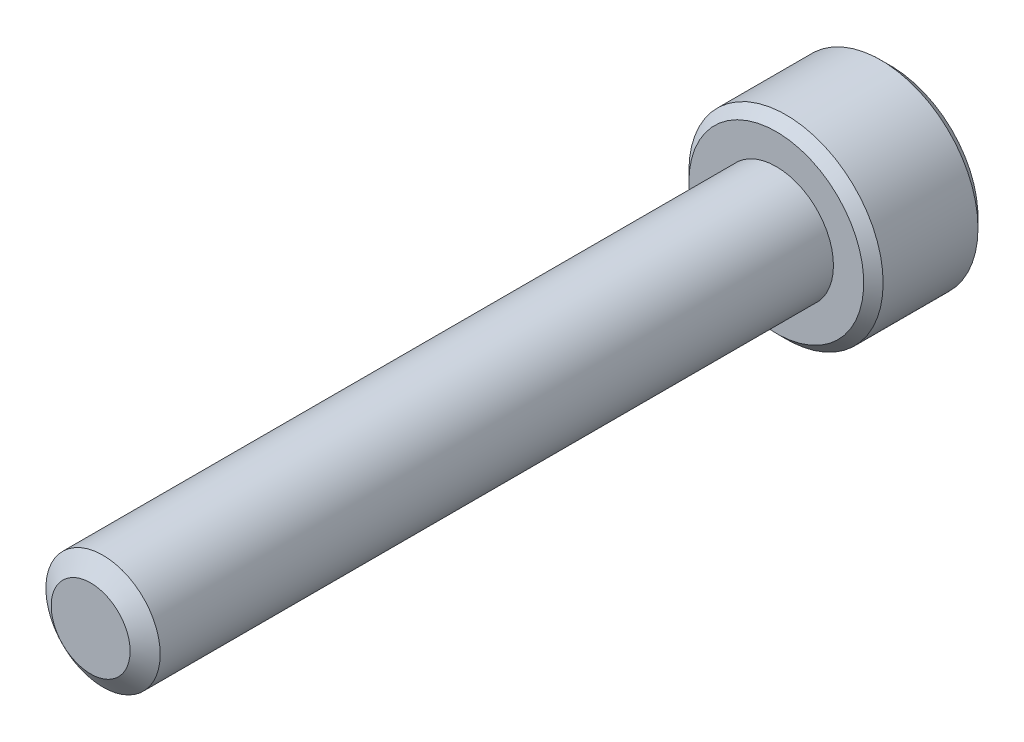
ISO-10303-21;
HEADER;
FILE_DESCRIPTION(('STEP AP214'),'2;1');
FILE_NAME('part.step','',(''),(''),'','','');
FILE_SCHEMA(('AUTOMOTIVE_DESIGN { 1 0 10303 214 1 1 1 1 }'));
ENDSEC;
DATA;
#1=APPLICATION_CONTEXT('core data for automotive mechanical design processes');
#2=APPLICATION_PROTOCOL_DEFINITION('international standard','automotive_design',2000,#1);
#3=PRODUCT_CONTEXT('',#1,'mechanical');
#4=PRODUCT('Part','Part','',(#3));
#5=PRODUCT_RELATED_PRODUCT_CATEGORY('part','',(#4));
#6=PRODUCT_DEFINITION_FORMATION('','',#4);
#7=PRODUCT_DEFINITION_CONTEXT('part definition',#1,'design');
#8=PRODUCT_DEFINITION('design','',#6,#7);
#9=PRODUCT_DEFINITION_SHAPE('','',#8);
#10=(LENGTH_UNIT() NAMED_UNIT(*) SI_UNIT(.MILLI.,.METRE.));
#11=(NAMED_UNIT(*) PLANE_ANGLE_UNIT() SI_UNIT($,.RADIAN.));
#12=(NAMED_UNIT(*) SI_UNIT($,.STERADIAN.) SOLID_ANGLE_UNIT());
#13=UNCERTAINTY_MEASURE_WITH_UNIT(LENGTH_MEASURE(1.E-05),#10,'distance_accuracy_value','');
#14=(GEOMETRIC_REPRESENTATION_CONTEXT(3) GLOBAL_UNCERTAINTY_ASSIGNED_CONTEXT((#13)) GLOBAL_UNIT_ASSIGNED_CONTEXT((#10,
#11,#12)) REPRESENTATION_CONTEXT('',''));
#15=CARTESIAN_POINT('',(0.,0.,0.));
#16=DIRECTION('',(0.,0.,1.));
#17=DIRECTION('',(1.,0.,0.));
#18=AXIS2_PLACEMENT_3D('',#15,#16,#17);
#19=CARTESIAN_POINT('',(0.,0.,-30.));
#20=DIRECTION('',(0.,0.,1.));
#21=DIRECTION('',(1.,0.,0.));
#22=AXIS2_PLACEMENT_3D('',#19,#20,#21);
#23=CYLINDRICAL_SURFACE('',#22,2.5);
#24=CARTESIAN_POINT('',(0.,0.,-30.));
#25=DIRECTION('',(0.,0.,-1.));
#26=DIRECTION('',(-1.,0.,0.));
#27=AXIS2_PLACEMENT_3D('',#24,#25,#26);
#28=CIRCLE('',#27,2.5);
#29=CARTESIAN_POINT('',(-2.5,0.,-30.));
#30=VERTEX_POINT('',#29);
#31=EDGE_CURVE('E213',#30,#30,#28,.F.);
#32=ORIENTED_EDGE('',*,*,#31,.T.);
#33=EDGE_LOOP('',(#32));
#34=FACE_BOUND('',#33,.T.);
#35=CARTESIAN_POINT('',(0.,0.,-0.541691224311848));
#36=DIRECTION('',(0.,0.,1.));
#37=DIRECTION('',(1.,0.,0.));
#38=AXIS2_PLACEMENT_3D('',#35,#36,#37);
#39=CIRCLE('',#38,2.5);
#40=CARTESIAN_POINT('',(2.5,0.,-0.541691224311848));
#41=VERTEX_POINT('',#40);
#42=EDGE_CURVE('E107',#41,#41,#39,.T.);
#43=ORIENTED_EDGE('',*,*,#42,.F.);
#44=EDGE_LOOP('',(#43));
#45=FACE_BOUND('',#44,.T.);
#46=ADVANCED_FACE('F33',(#34,#45),#23,.T.);
#47=CARTESIAN_POINT('',(0.,0.,0.));
#48=DIRECTION('',(0.,0.,-1.));
#49=DIRECTION('',(-1.,0.,0.));
#50=AXIS2_PLACEMENT_3D('',#47,#48,#49);
#51=CONICAL_SURFACE('',#50,1.72638475772933,0.959931088596884);
#52=ORIENTED_EDGE('',*,*,#42,.T.);
#53=EDGE_LOOP('',(#52));
#54=FACE_BOUND('',#53,.T.);
#55=CARTESIAN_POINT('',(0.,0.,0.));
#56=DIRECTION('',(0.,0.,1.));
#57=DIRECTION('',(1.,0.,0.));
#58=AXIS2_PLACEMENT_3D('',#55,#56,#57);
#59=CIRCLE('',#58,1.72638475772933);
#60=CARTESIAN_POINT('',(1.72638475772933,0.,0.));
#61=VERTEX_POINT('',#60);
#62=EDGE_CURVE('E211',#61,#61,#59,.T.);
#63=ORIENTED_EDGE('',*,*,#62,.F.);
#64=EDGE_LOOP('',(#63));
#65=FACE_BOUND('',#64,.T.);
#66=ADVANCED_FACE('F194',(#54,#65),#51,.T.);
#67=CARTESIAN_POINT('',(0.,0.,0.));
#68=DIRECTION('',(0.,0.,1.));
#69=DIRECTION('',(1.,0.,0.));
#70=AXIS2_PLACEMENT_3D('',#67,#68,#69);
#71=PLANE('',#70);
#72=ORIENTED_EDGE('',*,*,#62,.T.);
#73=EDGE_LOOP('',(#72));
#74=FACE_BOUND('',#73,.T.);
#75=ADVANCED_FACE('F191',(#74),#71,.T.);
#76=CARTESIAN_POINT('',(0.,0.,-35.));
#77=DIRECTION('',(0.,0.,1.));
#78=DIRECTION('',(1.,0.,0.));
#79=AXIS2_PLACEMENT_3D('',#76,#77,#78);
#80=CYLINDRICAL_SURFACE('',#79,4.25);
#81=CARTESIAN_POINT('',(0.,0.,-34.575));
#82=DIRECTION('',(0.,0.,-1.));
#83=DIRECTION('',(-1.,0.,0.));
#84=AXIS2_PLACEMENT_3D('',#81,#82,#83);
#85=CIRCLE('',#84,4.25);
#86=CARTESIAN_POINT('',(-4.25,0.,-34.575));
#87=VERTEX_POINT('',#86);
#88=EDGE_CURVE('E41',#87,#87,#85,.F.);
#89=ORIENTED_EDGE('',*,*,#88,.T.);
#90=EDGE_LOOP('',(#89));
#91=FACE_BOUND('',#90,.T.);
#92=CARTESIAN_POINT('',(0.,0.,-30.425));
#93=DIRECTION('',(0.,0.,-1.));
#94=DIRECTION('',(-1.,0.,0.));
#95=AXIS2_PLACEMENT_3D('',#92,#93,#94);
#96=CIRCLE('',#95,4.25);
#97=CARTESIAN_POINT('',(-4.25,0.,-30.425));
#98=VERTEX_POINT('',#97);
#99=EDGE_CURVE('E170',#98,#98,#96,.T.);
#100=ORIENTED_EDGE('',*,*,#99,.T.);
#101=EDGE_LOOP('',(#100));
#102=FACE_BOUND('',#101,.T.);
#103=ADVANCED_FACE('F175',(#91,#102),#80,.T.);
#104=CARTESIAN_POINT('',(0.,0.,-35.));
#105=DIRECTION('',(0.,0.,-1.));
#106=DIRECTION('',(-1.,0.,0.));
#107=AXIS2_PLACEMENT_3D('',#104,#105,#106);
#108=PLANE('',#107);
#109=CARTESIAN_POINT('',(0.,0.,-35.));
#110=DIRECTION('',(0.,0.,-1.));
#111=DIRECTION('',(-1.,0.,0.));
#112=AXIS2_PLACEMENT_3D('',#109,#110,#111);
#113=CIRCLE('',#112,3.82500000000001);
#114=CARTESIAN_POINT('',(-3.82500000000001,0.,-35.));
#115=VERTEX_POINT('',#114);
#116=EDGE_CURVE('E106',#115,#115,#113,.T.);
#117=ORIENTED_EDGE('',*,*,#116,.T.);
#118=EDGE_LOOP('',(#117));
#119=FACE_BOUND('',#118,.T.);
#120=CARTESIAN_POINT('',(0.,0.,-35.));
#121=DIRECTION('',(0.,0.,-1.));
#122=DIRECTION('',(-1.,0.,0.));
#123=AXIS2_PLACEMENT_3D('',#120,#121,#122);
#124=CIRCLE('',#123,2.3094010767585);
#125=CARTESIAN_POINT('',(-2.,1.15470053837925,-35.));
#126=VERTEX_POINT('',#125);
#127=CARTESIAN_POINT('',(0.,2.3094010767585,-35.));
#128=VERTEX_POINT('',#127);
#129=EDGE_CURVE('E87',#126,#128,#124,.T.);
#130=ORIENTED_EDGE('',*,*,#129,.F.);
#131=CARTESIAN_POINT('',(-2.,-1.15470053837925,-35.));
#132=VERTEX_POINT('',#131);
#133=EDGE_CURVE('E47',#132,#126,#124,.T.);
#134=ORIENTED_EDGE('',*,*,#133,.F.);
#135=CARTESIAN_POINT('',(0.,-2.3094010767585,-35.));
#136=VERTEX_POINT('',#135);
#137=EDGE_CURVE('E272',#136,#132,#124,.T.);
#138=ORIENTED_EDGE('',*,*,#137,.F.);
#139=CARTESIAN_POINT('',(2.,-1.15470053837925,-35.));
#140=VERTEX_POINT('',#139);
#141=EDGE_CURVE('E54',#140,#136,#124,.T.);
#142=ORIENTED_EDGE('',*,*,#141,.F.);
#143=CARTESIAN_POINT('',(2.,1.15470053837925,-35.));
#144=VERTEX_POINT('',#143);
#145=EDGE_CURVE('E128',#144,#140,#124,.T.);
#146=ORIENTED_EDGE('',*,*,#145,.F.);
#147=EDGE_CURVE('E96',#128,#144,#124,.T.);
#148=ORIENTED_EDGE('',*,*,#147,.F.);
#149=EDGE_LOOP('',(#130,#134,#138,#142,#146,#148));
#150=FACE_BOUND('',#149,.T.);
#151=ADVANCED_FACE('F127',(#119,#150),#108,.T.);
#152=CARTESIAN_POINT('',(0.,0.,-30.));
#153=DIRECTION('',(0.,0.,-1.));
#154=DIRECTION('',(-1.,0.,0.));
#155=AXIS2_PLACEMENT_3D('',#152,#153,#154);
#156=PLANE('',#155);
#157=CARTESIAN_POINT('',(0.,0.,-30.));
#158=DIRECTION('',(0.,0.,-1.));
#159=DIRECTION('',(-1.,0.,0.));
#160=AXIS2_PLACEMENT_3D('',#157,#158,#159);
#161=CIRCLE('',#160,3.82499999999999);
#162=CARTESIAN_POINT('',(-3.82499999999999,0.,-30.));
#163=VERTEX_POINT('',#162);
#164=EDGE_CURVE('E11',#163,#163,#161,.F.);
#165=ORIENTED_EDGE('',*,*,#164,.T.);
#166=EDGE_LOOP('',(#165));
#167=FACE_BOUND('',#166,.T.);
#168=ORIENTED_EDGE('',*,*,#31,.F.);
#169=EDGE_LOOP('',(#168));
#170=FACE_BOUND('',#169,.T.);
#171=ADVANCED_FACE('F184',(#167,#170),#156,.F.);
#172=CARTESIAN_POINT('',(0.,0.,-35.));
#173=DIRECTION('',(0.,0.,-1.));
#174=DIRECTION('',(-1.,0.,0.));
#175=AXIS2_PLACEMENT_3D('',#172,#173,#174);
#176=CONICAL_SURFACE('',#175,2.3094010767585,0.78539816339745);
#177=ORIENTED_EDGE('',*,*,#147,.T.);
#178=CARTESIAN_POINT('',(-0.000200000000000658,2.30951654681234,-35.0001154787137));
#179=CARTESIAN_POINT('',(0.0685530340307045,2.26982196410711,-34.9604530902256));
#180=CARTESIAN_POINT('',(0.138455742135511,2.22946361676572,-34.9231199822842));
#181=CARTESIAN_POINT('',(0.280995244550436,2.1471683966763,-34.8547636851361));
#182=CARTESIAN_POINT('',(0.353645597565358,2.10522369580642,-34.8237785337372));
#183=CARTESIAN_POINT('',(0.500141601053971,2.02064418875706,-34.7707002165441));
#184=CARTESIAN_POINT('',(0.573949935246294,1.97803092714269,-34.7484736271766));
#185=CARTESIAN_POINT('',(0.723191631835264,1.89186619344273,-34.7142288166751));
#186=CARTESIAN_POINT('',(0.798620433918152,1.84831735425552,-34.7021850291441));
#187=CARTESIAN_POINT('',(0.928615500671079,1.7732646674724,-34.6913185119056));
#188=CARTESIAN_POINT('',(0.983013783970109,1.74185780396625,-34.68970975361));
#189=CARTESIAN_POINT('',(1.09172145551969,1.67909540053412,-34.6924188775987));
#190=CARTESIAN_POINT('',(1.14603080592134,1.64773988246021,-34.696738837758));
#191=CARTESIAN_POINT('',(1.25413672758934,1.5853248994842,-34.7110595674099));
#192=CARTESIAN_POINT('',(1.30793265655479,1.55426580541469,-34.721066692762));
#193=CARTESIAN_POINT('',(1.41459426230557,1.49268469862228,-34.7462124302497));
#194=CARTESIAN_POINT('',(1.46746001007071,1.46216264491917,-34.7613506490422));
#195=CARTESIAN_POINT('',(1.60287973308984,1.38397803138049,-34.8062945034292));
#196=CARTESIAN_POINT('',(1.68459383484948,1.33680037273297,-34.8394888394258));
#197=CARTESIAN_POINT('',(1.8047470372578,1.26742988897853,-34.8955258231714));
#198=CARTESIAN_POINT('',(1.84434285210918,1.24456923461531,-34.9152147029469));
#199=CARTESIAN_POINT('',(1.92280095888787,1.19927142554652,-34.9563873183649));
#200=CARTESIAN_POINT('',(1.96166368359374,1.17683402097614,-34.9778699516512));
#201=CARTESIAN_POINT('',(2.0002,1.15458506832541,-35.0001154787137));
#202=B_SPLINE_CURVE_WITH_KNOTS('',3,(#178,#179,#180,#181,#182,#183,#184,#185,#186,#187,#188,
#189,#190,#191,#192,#193,#194,#195,#196,#197,#198,#199,#200,#201),.UNSPECIFIED.,.F.,.F.,(4,2,2,
2,2,2,2,2,2,2,2,4),(0.,0.266420613771064,0.534393751523387,0.798110374376916,1.06116288956936,
1.24939906803722,1.43770123566248,1.62621426093932,1.81471283831913,2.11415604834145,
2.2634717071779,2.41269626969771),.UNSPECIFIED.);
#203=EDGE_CURVE('E101',#128,#144,#202,.T.);
#204=ORIENTED_EDGE('',*,*,#203,.F.);
#205=EDGE_LOOP('',(#177,#204));
#206=FACE_BOUND('',#205,.T.);
#207=ADVANCED_FACE('F102',(#206),#176,.F.);
#208=ORIENTED_EDGE('',*,*,#145,.T.);
#209=CARTESIAN_POINT('',(2.,-2.30294417292923,-35.7407713550277));
#210=CARTESIAN_POINT('',(2.,-2.24687002663712,-35.698443273626));
#211=CARTESIAN_POINT('',(2.,-2.19048190536959,-35.6565251568643));
#212=CARTESIAN_POINT('',(2.,-2.07695390496424,-35.573690417861));
#213=CARTESIAN_POINT('',(2.,-2.01981384066454,-35.5327740496681));
#214=CARTESIAN_POINT('',(2.,-1.90424016804776,-35.4518334520186));
#215=CARTESIAN_POINT('',(2.,-1.8457999674391,-35.4118185915599));
#216=CARTESIAN_POINT('',(2.,-1.7279274546176,-35.3332889936643));
#217=CARTESIAN_POINT('',(2.,-1.66849521292324,-35.2947741502431));
#218=CARTESIAN_POINT('',(2.,-1.4816299571002,-35.1776406516043));
#219=CARTESIAN_POINT('',(2.,-1.35220318163536,-35.1021459017296));
#220=CARTESIAN_POINT('',(2.,-1.08689521592925,-34.9640493509944));
#221=CARTESIAN_POINT('',(2.,-0.951037763938192,-34.9014040859035));
#222=CARTESIAN_POINT('',(2.,-0.747111912259409,-34.8247635438751));
#223=CARTESIAN_POINT('',(2.,-0.682064034147876,-34.8027671799191));
#224=CARTESIAN_POINT('',(2.,-0.550398103294752,-34.7639966876601));
#225=CARTESIAN_POINT('',(2.,-0.483779942722475,-34.7472229191212));
#226=CARTESIAN_POINT('',(2.,-0.350484328847653,-34.7200482578844));
#227=CARTESIAN_POINT('',(2.,-0.283829489364784,-34.7095381767417));
#228=CARTESIAN_POINT('',(2.,-0.149806987139375,-34.6950960855449));
#229=CARTESIAN_POINT('',(2.,-0.0824394489341207,-34.6911629447331));
#230=CARTESIAN_POINT('',(2.,0.049905562294491,-34.6901664769337));
#231=CARTESIAN_POINT('',(2.,0.114881285143174,-34.6928596448504));
#232=CARTESIAN_POINT('',(2.,0.244275921482762,-34.7044300704227));
#233=CARTESIAN_POINT('',(2.,0.308694780266755,-34.7133079288332));
#234=CARTESIAN_POINT('',(2.,0.437599788610706,-34.7369136592961));
#235=CARTESIAN_POINT('',(2.,0.502067428644597,-34.7517410834465));
#236=CARTESIAN_POINT('',(2.,0.629594322598308,-34.786457883628));
#237=CARTESIAN_POINT('',(2.,0.692653693883152,-34.8063468361063));
#238=CARTESIAN_POINT('',(2.,0.891187889210544,-34.8764469792562));
#239=CARTESIAN_POINT('',(2.,1.02383545707306,-34.9346418003215));
#240=CARTESIAN_POINT('',(2.,1.28290932150074,-35.0640305754596));
#241=CARTESIAN_POINT('',(2.,1.4093111258757,-35.1352712314148));
#242=CARTESIAN_POINT('',(2.,1.59200441438963,-35.2464419918747));
#243=CARTESIAN_POINT('',(2.,1.65027549026191,-35.2831821903374));
#244=CARTESIAN_POINT('',(2.,1.76581760389243,-35.3582145141838));
#245=CARTESIAN_POINT('',(2.,1.82308856543105,-35.396506757118));
#246=CARTESIAN_POINT('',(2.,1.93629654762084,-35.4740422640812));
#247=CARTESIAN_POINT('',(2.,1.99224062500539,-35.5132752761336));
#248=CARTESIAN_POINT('',(2.,2.103364240299,-35.5927788307365));
#249=CARTESIAN_POINT('',(2.,2.15854398422468,-35.6330490850006));
#250=CARTESIAN_POINT('',(2.,2.21340370692659,-35.6737442381459));
#251=B_SPLINE_CURVE_WITH_KNOTS('',3,(#209,#210,#211,#212,#213,#214,#215,#216,#217,#218,#219,
#220,#221,#222,#223,#224,#225,#226,#227,#228,#229,#230,#231,#232,#233,#234,#235,#236,#237,#238,
#239,#240,#241,#242,#243,#244,#245,#246,#247,#248,#249,#250),.UNSPECIFIED.,.F.,.F.,(4,2,2,2,2,2,
2,2,2,2,2,2,2,2,2,2,2,2,2,2,4),(0.,0.210772731976897,0.421598374658589,0.634057554623493,
0.846501695870168,1.29562155455624,1.74319622821645,1.94902062110207,2.15485918928326,
2.35699582502635,2.5590977043214,2.75388435553556,2.94868993014815,3.14690093452586,
3.34509535789702,3.77838155837653,4.21325029921625,4.41989056685647,4.62654651460921,
4.8315237711129,5.03644465914085),.UNSPECIFIED.);
#252=EDGE_CURVE('E95',#144,#140,#251,.F.);
#253=ORIENTED_EDGE('',*,*,#252,.F.);
#254=EDGE_LOOP('',(#208,#253));
#255=FACE_BOUND('',#254,.T.);
#256=ADVANCED_FACE('F278',(#255),#176,.F.);
#257=ORIENTED_EDGE('',*,*,#141,.T.);
#258=CARTESIAN_POINT('',(2.0002,-1.15458506832541,-35.0001154787137));
#259=CARTESIAN_POINT('',(1.9314469659693,-1.19427965103064,-34.9604530902256));
#260=CARTESIAN_POINT('',(1.86154425786449,-1.23463799837204,-34.9231199822842));
#261=CARTESIAN_POINT('',(1.71900475544956,-1.31693321846145,-34.8547636851361));
#262=CARTESIAN_POINT('',(1.64635440243464,-1.35887791933134,-34.8237785337372));
#263=CARTESIAN_POINT('',(1.49985839894603,-1.44345742638069,-34.7707002165441));
#264=CARTESIAN_POINT('',(1.42605006475371,-1.48607068799507,-34.7484736271766));
#265=CARTESIAN_POINT('',(1.27680836816473,-1.57223542169503,-34.7142288166751));
#266=CARTESIAN_POINT('',(1.20137956608185,-1.61578426088223,-34.7021850291441));
#267=CARTESIAN_POINT('',(1.07138449932892,-1.69083694766536,-34.6913185119056));
#268=CARTESIAN_POINT('',(1.01698621602989,-1.72224381117151,-34.68970975361));
#269=CARTESIAN_POINT('',(0.908278544480305,-1.78500621460364,-34.6924188775987));
#270=CARTESIAN_POINT('',(0.853969194078659,-1.81636173267754,-34.696738837758));
#271=CARTESIAN_POINT('',(0.745863272410661,-1.87877671565355,-34.7110595674099));
#272=CARTESIAN_POINT('',(0.692067343445207,-1.90983580972306,-34.721066692762));
#273=CARTESIAN_POINT('',(0.585405737694426,-1.97141691651548,-34.7462124302497));
#274=CARTESIAN_POINT('',(0.532539989929286,-2.00193897021859,-34.7613506490422));
#275=CARTESIAN_POINT('',(0.397120266910154,-2.08012358375727,-34.8062945034292));
#276=CARTESIAN_POINT('',(0.31540616515052,-2.12730124240478,-34.8394888394258));
#277=CARTESIAN_POINT('',(0.195252962742195,-2.19667172615922,-34.8955258231714));
#278=CARTESIAN_POINT('',(0.155657147890821,-2.21953238052245,-34.9152147029469));
#279=CARTESIAN_POINT('',(0.077199041112126,-2.26483018959124,-34.9563873183649));
#280=CARTESIAN_POINT('',(0.0383363164062586,-2.28726759416161,-34.9778699516512));
#281=CARTESIAN_POINT('',(-0.000200000000000028,-2.30951654681234,-35.0001154787137));
#282=B_SPLINE_CURVE_WITH_KNOTS('',3,(#258,#259,#260,#261,#262,#263,#264,#265,#266,#267,#268,
#269,#270,#271,#272,#273,#274,#275,#276,#277,#278,#279,#280,#281),.UNSPECIFIED.,.F.,.F.,(4,2,2,
2,2,2,2,2,2,2,2,4),(0.,0.266420613771062,0.534393751523388,0.798110374376917,1.06116288956937,
1.24939906803722,1.43770123566248,1.62621426093932,1.81471283831914,2.11415604834145,
2.26347170717791,2.41269626969771),.UNSPECIFIED.);
#283=EDGE_CURVE('E138',#140,#136,#282,.T.);
#284=ORIENTED_EDGE('',*,*,#283,.F.);
#285=EDGE_LOOP('',(#257,#284));
#286=FACE_BOUND('',#285,.T.);
#287=ADVANCED_FACE('F275',(#286),#176,.F.);
#288=ORIENTED_EDGE('',*,*,#137,.T.);
#289=CARTESIAN_POINT('',(0.00020000000000056,-2.30951654681234,-35.0001154787137));
#290=CARTESIAN_POINT('',(-0.0685530340307041,-2.26982196410711,-34.9604530902256));
#291=CARTESIAN_POINT('',(-0.13845574213551,-2.22946361676572,-34.9231199822842));
#292=CARTESIAN_POINT('',(-0.280995244550436,-2.1471683966763,-34.8547636851361));
#293=CARTESIAN_POINT('',(-0.353645597565358,-2.10522369580642,-34.8237785337372));
#294=CARTESIAN_POINT('',(-0.500141601053972,-2.02064418875706,-34.7707002165441));
#295=CARTESIAN_POINT('',(-0.573949935246295,-1.97803092714269,-34.7484736271766));
#296=CARTESIAN_POINT('',(-0.723191631835264,-1.89186619344273,-34.7142288166751));
#297=CARTESIAN_POINT('',(-0.798620433918152,-1.84831735425552,-34.7021850291441));
#298=CARTESIAN_POINT('',(-0.92861550067108,-1.7732646674724,-34.6913185119056));
#299=CARTESIAN_POINT('',(-0.98301378397011,-1.74185780396625,-34.68970975361));
#300=CARTESIAN_POINT('',(-1.09172145551969,-1.67909540053412,-34.6924188775987));
#301=CARTESIAN_POINT('',(-1.14603080592134,-1.64773988246021,-34.696738837758));
#302=CARTESIAN_POINT('',(-1.25413672758934,-1.5853248994842,-34.7110595674099));
#303=CARTESIAN_POINT('',(-1.30793265655479,-1.55426580541469,-34.721066692762));
#304=CARTESIAN_POINT('',(-1.41459426230557,-1.49268469862228,-34.7462124302497));
#305=CARTESIAN_POINT('',(-1.46746001007071,-1.46216264491917,-34.7613506490422));
#306=CARTESIAN_POINT('',(-1.60287973308984,-1.38397803138049,-34.8062945034292));
#307=CARTESIAN_POINT('',(-1.68459383484948,-1.33680037273297,-34.8394888394258));
#308=CARTESIAN_POINT('',(-1.8047470372578,-1.26742988897853,-34.8955258231714));
#309=CARTESIAN_POINT('',(-1.84434285210918,-1.24456923461531,-34.9152147029469));
#310=CARTESIAN_POINT('',(-1.92280095888787,-1.19927142554652,-34.9563873183649));
#311=CARTESIAN_POINT('',(-1.96166368359374,-1.17683402097614,-34.9778699516512));
#312=CARTESIAN_POINT('',(-2.0002,-1.15458506832541,-35.0001154787137));
#313=B_SPLINE_CURVE_WITH_KNOTS('',3,(#289,#290,#291,#292,#293,#294,#295,#296,#297,#298,#299,
#300,#301,#302,#303,#304,#305,#306,#307,#308,#309,#310,#311,#312),.UNSPECIFIED.,.F.,.F.,(4,2,2,
2,2,2,2,2,2,2,2,4),(0.,0.266420613771063,0.534393751523388,0.798110374376916,1.06116288956937,
1.24939906803722,1.43770123566248,1.62621426093932,1.81471283831913,2.11415604834145,
2.26347170717791,2.41269626969771),.UNSPECIFIED.);
#314=EDGE_CURVE('E249',#136,#132,#313,.T.);
#315=ORIENTED_EDGE('',*,*,#314,.F.);
#316=EDGE_LOOP('',(#288,#315));
#317=FACE_BOUND('',#316,.T.);
#318=ADVANCED_FACE('F274',(#317),#176,.F.);
#319=ORIENTED_EDGE('',*,*,#133,.T.);
#320=CARTESIAN_POINT('',(-2.,-2.30294417326429,-35.7407713552807));
#321=CARTESIAN_POINT('',(-2.,-2.24687002696278,-35.6984432738692));
#322=CARTESIAN_POINT('',(-2.,-2.19048190568582,-35.6565251570978));
#323=CARTESIAN_POINT('',(-2.,-2.07695390526152,-35.5736904180751));
#324=CARTESIAN_POINT('',(-2.,-2.01981384095229,-35.5327740498725));
#325=CARTESIAN_POINT('',(-2.,-1.90424016831613,-35.4518334522036));
#326=CARTESIAN_POINT('',(-2.,-1.84579996769763,-35.4118185917351));
#327=CARTESIAN_POINT('',(-2.,-1.72792745485625,-35.3332889938203));
#328=CARTESIAN_POINT('',(-2.,-1.66849521315186,-35.2947741503895));
#329=CARTESIAN_POINT('',(-2.,-1.48162995729573,-35.1776406517203));
#330=CARTESIAN_POINT('',(-2.,-1.35220318180736,-35.1021459018253));
#331=CARTESIAN_POINT('',(-2.,-1.08689521605219,-34.9640493510523));
#332=CARTESIAN_POINT('',(-2.,-0.951037764035625,-34.901404085944));
#333=CARTESIAN_POINT('',(-2.,-0.747111912337645,-34.8247635439028));
#334=CARTESIAN_POINT('',(-2.,-0.68206403423415,-34.8027671799472));
#335=CARTESIAN_POINT('',(-2.,-0.550398103397367,-34.7639966876876));
#336=CARTESIAN_POINT('',(-2.,-0.483779942833393,-34.7472229191476));
#337=CARTESIAN_POINT('',(-2.,-0.350484328974901,-34.7200482579067));
#338=CARTESIAN_POINT('',(-2.,-0.283829489500056,-34.709538176761));
#339=CARTESIAN_POINT('',(-2.,-0.149806987290425,-34.6950960855565));
#340=CARTESIAN_POINT('',(-2.,-0.0824394490929259,-34.6911629447399));
#341=CARTESIAN_POINT('',(-2.,0.0499055621213773,-34.6901664769296));
#342=CARTESIAN_POINT('',(-2.,0.114881284963487,-34.6928596448403));
#343=CARTESIAN_POINT('',(-2.,0.244275921290586,-34.7044300703996));
#344=CARTESIAN_POINT('',(-2.,0.308694780068663,-34.7133079288031));
#345=CARTESIAN_POINT('',(-2.,0.437599788400935,-34.7369136592514));
#346=CARTESIAN_POINT('',(-2.,0.502067428429081,-34.7517410833941));
#347=CARTESIAN_POINT('',(-2.,0.629594322371855,-34.78645788356));
#348=CARTESIAN_POINT('',(-2.,0.692653693651508,-34.8063468360305));
#349=CARTESIAN_POINT('',(-2.,0.89118788892846,-34.8764469791434));
#350=CARTESIAN_POINT('',(-2.,1.02383545674826,-34.9346418001747));
#351=CARTESIAN_POINT('',(-2.,1.28290932109377,-35.0640305752409));
#352=CARTESIAN_POINT('',(-2.,1.40931112542931,-35.1352712311583));
#353=CARTESIAN_POINT('',(-2.,1.59200441388853,-35.2464419915627));
#354=CARTESIAN_POINT('',(-2.,1.6502754897448,-35.2831821900083));
#355=CARTESIAN_POINT('',(-2.,1.76581760334353,-35.3582145138205));
#356=CARTESIAN_POINT('',(-2.,1.82308856486637,-35.3965067567377));
#357=CARTESIAN_POINT('',(-2.,1.93629654702499,-35.4740422636668));
#358=CARTESIAN_POINT('',(-2.,1.99224062439413,-35.5132752757022));
#359=CARTESIAN_POINT('',(-2.,2.10336423965704,-35.5927788302713));
#360=CARTESIAN_POINT('',(-2.,2.15854398356742,-35.6330490845185));
#361=CARTESIAN_POINT('',(-2.,2.21340370625405,-35.6737442376469));
#362=B_SPLINE_CURVE_WITH_KNOTS('',3,(#320,#321,#322,#323,#324,#325,#326,#327,#328,#329,#330,
#331,#332,#333,#334,#335,#336,#337,#338,#339,#340,#341,#342,#343,#344,#345,#346,#347,#348,#349,
#350,#351,#352,#353,#354,#355,#356,#357,#358,#359,#360,#361),.UNSPECIFIED.,.F.,.F.,(4,2,2,2,2,2,
2,2,2,2,2,2,2,2,2,2,2,2,2,2,4),(0.,0.210772732017007,0.421598374738837,0.634057554744618,
0.846501696032178,1.29562155480993,1.74319622856096,1.94902062142334,2.15485918958132,
2.35699582530215,2.55909770457494,2.75388435576874,2.94868993036093,3.14690093471669,
3.34509535806591,3.7783815583877,4.21325029906865,4.41989056664096,4.62654651432578,
4.83152377076247,5.03644465872343),.UNSPECIFIED.);
#363=EDGE_CURVE('E117',#132,#126,#362,.T.);
#364=ORIENTED_EDGE('',*,*,#363,.F.);
#365=EDGE_LOOP('',(#319,#364));
#366=FACE_BOUND('',#365,.T.);
#367=ADVANCED_FACE('F287',(#366),#176,.F.);
#368=ORIENTED_EDGE('',*,*,#129,.T.);
#369=CARTESIAN_POINT('',(-2.0002,1.15458506832541,-35.0001154787137));
#370=CARTESIAN_POINT('',(-1.93144696596929,1.19427965103064,-34.9604530902256));
#371=CARTESIAN_POINT('',(-1.86154425786449,1.23463799837204,-34.9231199822842));
#372=CARTESIAN_POINT('',(-1.71900475544956,1.31693321846145,-34.8547636851361));
#373=CARTESIAN_POINT('',(-1.64635440243464,1.35887791933134,-34.8237785337372));
#374=CARTESIAN_POINT('',(-1.49985839894603,1.44345742638069,-34.7707002165441));
#375=CARTESIAN_POINT('',(-1.42605006475371,1.48607068799507,-34.7484736271766));
#376=CARTESIAN_POINT('',(-1.27680836816474,1.57223542169503,-34.7142288166751));
#377=CARTESIAN_POINT('',(-1.20137956608185,1.61578426088223,-34.7021850291441));
#378=CARTESIAN_POINT('',(-1.07138449932892,1.69083694766536,-34.6913185119056));
#379=CARTESIAN_POINT('',(-1.01698621602989,1.72224381117151,-34.68970975361));
#380=CARTESIAN_POINT('',(-0.908278544480305,1.78500621460364,-34.6924188775987));
#381=CARTESIAN_POINT('',(-0.85396919407866,1.81636173267754,-34.696738837758));
#382=CARTESIAN_POINT('',(-0.745863272410661,1.87877671565355,-34.7110595674099));
#383=CARTESIAN_POINT('',(-0.692067343445207,1.90983580972306,-34.721066692762));
#384=CARTESIAN_POINT('',(-0.585405737694425,1.97141691651547,-34.7462124302497));
#385=CARTESIAN_POINT('',(-0.532539989929286,2.00193897021859,-34.7613506490422));
#386=CARTESIAN_POINT('',(-0.397120266910154,2.08012358375727,-34.8062945034292));
#387=CARTESIAN_POINT('',(-0.315406165150519,2.12730124240478,-34.8394888394258));
#388=CARTESIAN_POINT('',(-0.195252962742196,2.19667172615922,-34.8955258231714));
#389=CARTESIAN_POINT('',(-0.155657147890822,2.21953238052245,-34.9152147029469));
#390=CARTESIAN_POINT('',(-0.0771990411121279,2.26483018959123,-34.9563873183649));
#391=CARTESIAN_POINT('',(-0.0383363164062598,2.28726759416161,-34.9778699516512));
#392=CARTESIAN_POINT('',(0.000200000000000961,2.30951654681234,-35.0001154787137));
#393=B_SPLINE_CURVE_WITH_KNOTS('',3,(#369,#370,#371,#372,#373,#374,#375,#376,#377,#378,#379,
#380,#381,#382,#383,#384,#385,#386,#387,#388,#389,#390,#391,#392),.UNSPECIFIED.,.F.,.F.,(4,2,2,
2,2,2,2,2,2,2,2,4),(0.,0.266420613771064,0.534393751523388,0.798110374376916,1.06116288956937,
1.24939906803722,1.43770123566248,1.62621426093932,1.81471283831913,2.11415604834145,
2.26347170717791,2.41269626969771),.UNSPECIFIED.);
#394=EDGE_CURVE('E91',#126,#128,#393,.T.);
#395=ORIENTED_EDGE('',*,*,#394,.F.);
#396=EDGE_LOOP('',(#368,#395));
#397=FACE_BOUND('',#396,.T.);
#398=ADVANCED_FACE('F89',(#397),#176,.F.);
#399=CARTESIAN_POINT('',(2.,3.46410161513775,-32.));
#400=DIRECTION('',(0.,0.,-1.));
#401=DIRECTION('',(-1.,0.,0.));
#402=AXIS2_PLACEMENT_3D('',#399,#400,#401);
#403=PLANE('',#402);
#404=DIRECTION('',(0.866025403784439,0.5,0.));
#405=VECTOR('',#404,1.);
#406=CARTESIAN_POINT('',(-2.,1.15470053837925,-32.));
#407=LINE('',#406,#405);
#408=CARTESIAN_POINT('',(-2.,1.15470053837925,-32.));
#409=VERTEX_POINT('',#408);
#410=CARTESIAN_POINT('',(0.,2.3094010767585,-32.));
#411=VERTEX_POINT('',#410);
#412=EDGE_CURVE('E116',#409,#411,#407,.T.);
#413=ORIENTED_EDGE('',*,*,#412,.T.);
#414=DIRECTION('',(0.866025403784439,-0.5,0.));
#415=VECTOR('',#414,1.);
#416=CARTESIAN_POINT('',(0.,2.3094010767585,-32.));
#417=LINE('',#416,#415);
#418=CARTESIAN_POINT('',(2.,1.15470053837925,-32.));
#419=VERTEX_POINT('',#418);
#420=EDGE_CURVE('E121',#411,#419,#417,.T.);
#421=ORIENTED_EDGE('',*,*,#420,.T.);
#422=DIRECTION('',(0.,-1.,0.));
#423=VECTOR('',#422,1.);
#424=CARTESIAN_POINT('',(2.,1.15470053837925,-32.));
#425=LINE('',#424,#423);
#426=CARTESIAN_POINT('',(2.,-1.15470053837925,-32.));
#427=VERTEX_POINT('',#426);
#428=EDGE_CURVE('E235',#419,#427,#425,.T.);
#429=ORIENTED_EDGE('',*,*,#428,.T.);
#430=DIRECTION('',(-0.866025403784439,-0.5,0.));
#431=VECTOR('',#430,1.);
#432=CARTESIAN_POINT('',(2.,-1.15470053837925,-32.));
#433=LINE('',#432,#431);
#434=CARTESIAN_POINT('',(0.,-2.3094010767585,-32.));
#435=VERTEX_POINT('',#434);
#436=EDGE_CURVE('E232',#427,#435,#433,.T.);
#437=ORIENTED_EDGE('',*,*,#436,.T.);
#438=DIRECTION('',(-0.866025403784439,0.5,0.));
#439=VECTOR('',#438,1.);
#440=CARTESIAN_POINT('',(0.,-2.3094010767585,-32.));
#441=LINE('',#440,#439);
#442=CARTESIAN_POINT('',(-2.,-1.15470053837925,-32.));
#443=VERTEX_POINT('',#442);
#444=EDGE_CURVE('E229',#435,#443,#441,.T.);
#445=ORIENTED_EDGE('',*,*,#444,.T.);
#446=DIRECTION('',(0.,1.,0.));
#447=VECTOR('',#446,1.);
#448=CARTESIAN_POINT('',(-2.,-1.15470053837925,-32.));
#449=LINE('',#448,#447);
#450=EDGE_CURVE('E124',#443,#409,#449,.T.);
#451=ORIENTED_EDGE('',*,*,#450,.T.);
#452=EDGE_LOOP('',(#413,#421,#429,#437,#445,#451));
#453=FACE_BOUND('',#452,.T.);
#454=ADVANCED_FACE('F158',(#453),#403,.T.);
#455=CARTESIAN_POINT('',(0.,2.3094010767585,-32.));
#456=DIRECTION('',(0.5,0.866025403784439,0.));
#457=DIRECTION('',(-0.866025403784439,0.5,0.));
#458=AXIS2_PLACEMENT_3D('',#455,#456,#457);
#459=PLANE('',#458);
#460=DIRECTION('',(0.,0.,-1.));
#461=VECTOR('',#460,1.);
#462=CARTESIAN_POINT('',(0.,2.3094010767585,-32.));
#463=LINE('',#462,#461);
#464=EDGE_CURVE('E113',#411,#128,#463,.T.);
#465=ORIENTED_EDGE('',*,*,#464,.T.);
#466=ORIENTED_EDGE('',*,*,#203,.T.);
#467=DIRECTION('',(0.,0.,-1.));
#468=VECTOR('',#467,1.);
#469=CARTESIAN_POINT('',(2.,1.15470053837925,-32.));
#470=LINE('',#469,#468);
#471=EDGE_CURVE('E123',#419,#144,#470,.T.);
#472=ORIENTED_EDGE('',*,*,#471,.F.);
#473=ORIENTED_EDGE('',*,*,#420,.F.);
#474=EDGE_LOOP('',(#465,#466,#472,#473));
#475=FACE_BOUND('',#474,.T.);
#476=ADVANCED_FACE('F119',(#475),#459,.F.);
#477=CARTESIAN_POINT('',(2.,1.15470053837925,-32.));
#478=DIRECTION('',(1.,0.,0.));
#479=DIRECTION('',(0.,0.,-1.));
#480=AXIS2_PLACEMENT_3D('',#477,#478,#479);
#481=PLANE('',#480);
#482=ORIENTED_EDGE('',*,*,#471,.T.);
#483=ORIENTED_EDGE('',*,*,#252,.T.);
#484=DIRECTION('',(0.,0.,-1.));
#485=VECTOR('',#484,1.);
#486=CARTESIAN_POINT('',(2.,-1.15470053837925,-32.));
#487=LINE('',#486,#485);
#488=EDGE_CURVE('E218',#427,#140,#487,.T.);
#489=ORIENTED_EDGE('',*,*,#488,.F.);
#490=ORIENTED_EDGE('',*,*,#428,.F.);
#491=EDGE_LOOP('',(#482,#483,#489,#490));
#492=FACE_BOUND('',#491,.T.);
#493=ADVANCED_FACE('F147',(#492),#481,.F.);
#494=CARTESIAN_POINT('',(2.,-1.15470053837925,-32.));
#495=DIRECTION('',(0.5,-0.866025403784439,0.));
#496=DIRECTION('',(0.866025403784439,0.5,0.));
#497=AXIS2_PLACEMENT_3D('',#494,#495,#496);
#498=PLANE('',#497);
#499=ORIENTED_EDGE('',*,*,#488,.T.);
#500=ORIENTED_EDGE('',*,*,#283,.T.);
#501=DIRECTION('',(0.,0.,-1.));
#502=VECTOR('',#501,1.);
#503=CARTESIAN_POINT('',(0.,-2.3094010767585,-32.));
#504=LINE('',#503,#502);
#505=EDGE_CURVE('E221',#435,#136,#504,.T.);
#506=ORIENTED_EDGE('',*,*,#505,.F.);
#507=ORIENTED_EDGE('',*,*,#436,.F.);
#508=EDGE_LOOP('',(#499,#500,#506,#507));
#509=FACE_BOUND('',#508,.T.);
#510=ADVANCED_FACE('F151',(#509),#498,.F.);
#511=CARTESIAN_POINT('',(0.,-2.3094010767585,-32.));
#512=DIRECTION('',(-0.5,-0.866025403784439,0.));
#513=DIRECTION('',(0.866025403784439,-0.5,0.));
#514=AXIS2_PLACEMENT_3D('',#511,#512,#513);
#515=PLANE('',#514);
#516=ORIENTED_EDGE('',*,*,#505,.T.);
#517=ORIENTED_EDGE('',*,*,#314,.T.);
#518=DIRECTION('',(0.,0.,-1.));
#519=VECTOR('',#518,1.);
#520=CARTESIAN_POINT('',(-2.,-1.15470053837925,-32.));
#521=LINE('',#520,#519);
#522=EDGE_CURVE('E224',#443,#132,#521,.T.);
#523=ORIENTED_EDGE('',*,*,#522,.F.);
#524=ORIENTED_EDGE('',*,*,#444,.F.);
#525=EDGE_LOOP('',(#516,#517,#523,#524));
#526=FACE_BOUND('',#525,.T.);
#527=ADVANCED_FACE('F257',(#526),#515,.F.);
#528=CARTESIAN_POINT('',(-2.,-1.15470053837925,-32.));
#529=DIRECTION('',(-1.,0.,0.));
#530=DIRECTION('',(0.,-1.,0.));
#531=AXIS2_PLACEMENT_3D('',#528,#529,#530);
#532=PLANE('',#531);
#533=ORIENTED_EDGE('',*,*,#522,.T.);
#534=ORIENTED_EDGE('',*,*,#363,.T.);
#535=DIRECTION('',(0.,0.,-1.));
#536=VECTOR('',#535,1.);
#537=CARTESIAN_POINT('',(-2.,1.15470053837925,-32.));
#538=LINE('',#537,#536);
#539=EDGE_CURVE('E115',#409,#126,#538,.T.);
#540=ORIENTED_EDGE('',*,*,#539,.F.);
#541=ORIENTED_EDGE('',*,*,#450,.F.);
#542=EDGE_LOOP('',(#533,#534,#540,#541));
#543=FACE_BOUND('',#542,.T.);
#544=ADVANCED_FACE('F254',(#543),#532,.F.);
#545=CARTESIAN_POINT('',(-2.,1.15470053837925,-32.));
#546=DIRECTION('',(-0.5,0.866025403784439,0.));
#547=DIRECTION('',(-0.866025403784439,-0.5,0.));
#548=AXIS2_PLACEMENT_3D('',#545,#546,#547);
#549=PLANE('',#548);
#550=ORIENTED_EDGE('',*,*,#539,.T.);
#551=ORIENTED_EDGE('',*,*,#394,.T.);
#552=ORIENTED_EDGE('',*,*,#464,.F.);
#553=ORIENTED_EDGE('',*,*,#412,.F.);
#554=EDGE_LOOP('',(#550,#551,#552,#553));
#555=FACE_BOUND('',#554,.T.);
#556=ADVANCED_FACE('F111',(#555),#549,.F.);
#557=CARTESIAN_POINT('',(0.,0.,-35.));
#558=DIRECTION('',(0.,0.,1.));
#559=DIRECTION('',(1.,0.,0.));
#560=AXIS2_PLACEMENT_3D('',#557,#558,#559);
#561=CONICAL_SURFACE('',#560,3.82500000000001,0.785398163397448);
#562=ORIENTED_EDGE('',*,*,#88,.F.);
#563=EDGE_LOOP('',(#562));
#564=FACE_BOUND('',#563,.T.);
#565=ORIENTED_EDGE('',*,*,#116,.F.);
#566=EDGE_LOOP('',(#565));
#567=FACE_BOUND('',#566,.T.);
#568=ADVANCED_FACE('F178',(#564,#567),#561,.T.);
#569=CARTESIAN_POINT('',(0.,0.,-30.425));
#570=DIRECTION('',(0.,0.,-1.));
#571=DIRECTION('',(-1.,0.,0.));
#572=AXIS2_PLACEMENT_3D('',#569,#570,#571);
#573=CONICAL_SURFACE('',#572,4.25,0.785398163397452);
#574=CARTESIAN_POINT('',(-3.82499999999999,0.,-30.));
#575=CARTESIAN_POINT('',(-3.82942708333333,0.,-30.0044270833333));
#576=CARTESIAN_POINT('',(-3.83385416666666,0.,-30.0088541666667));
#577=CARTESIAN_POINT('',(-3.84270833333333,0.,-30.0177083333333));
#578=CARTESIAN_POINT('',(-3.84713541666666,0.,-30.0221354166667));
#579=CARTESIAN_POINT('',(-3.85598958333333,0.,-30.0309895833333));
#580=CARTESIAN_POINT('',(-3.86041666666666,0.,-30.0354166666667));
#581=CARTESIAN_POINT('',(-3.86927083333333,0.,-30.0442708333333));
#582=CARTESIAN_POINT('',(-3.87369791666666,0.,-30.0486979166667));
#583=CARTESIAN_POINT('',(-3.88255208333333,0.,-30.0575520833333));
#584=CARTESIAN_POINT('',(-3.88697916666666,0.,-30.0619791666667));
#585=CARTESIAN_POINT('',(-3.89583333333333,0.,-30.0708333333333));
#586=CARTESIAN_POINT('',(-3.90026041666666,0.,-30.0752604166667));
#587=CARTESIAN_POINT('',(-3.90911458333333,0.,-30.0841145833333));
#588=CARTESIAN_POINT('',(-3.91354166666666,0.,-30.0885416666667));
#589=CARTESIAN_POINT('',(-3.92239583333333,0.,-30.0973958333333));
#590=CARTESIAN_POINT('',(-3.92682291666666,0.,-30.1018229166667));
#591=CARTESIAN_POINT('',(-3.93567708333333,0.,-30.1106770833333));
#592=CARTESIAN_POINT('',(-3.94010416666666,0.,-30.1151041666667));
#593=CARTESIAN_POINT('',(-3.94895833333333,0.,-30.1239583333333));
#594=CARTESIAN_POINT('',(-3.95338541666666,0.,-30.1283854166667));
#595=CARTESIAN_POINT('',(-3.96223958333333,0.,-30.1372395833333));
#596=CARTESIAN_POINT('',(-3.96666666666666,0.,-30.1416666666667));
#597=CARTESIAN_POINT('',(-3.97552083333333,0.,-30.1505208333333));
#598=CARTESIAN_POINT('',(-3.97994791666666,0.,-30.1549479166667));
#599=CARTESIAN_POINT('',(-3.98880208333333,0.,-30.1638020833333));
#600=CARTESIAN_POINT('',(-3.99322916666666,0.,-30.1682291666667));
#601=CARTESIAN_POINT('',(-4.00208333333333,0.,-30.1770833333333));
#602=CARTESIAN_POINT('',(-4.00651041666666,0.,-30.1815104166667));
#603=CARTESIAN_POINT('',(-4.01536458333333,0.,-30.1903645833333));
#604=CARTESIAN_POINT('',(-4.01979166666666,0.,-30.1947916666667));
#605=CARTESIAN_POINT('',(-4.02864583333333,0.,-30.2036458333333));
#606=CARTESIAN_POINT('',(-4.03307291666666,0.,-30.2080729166667));
#607=CARTESIAN_POINT('',(-4.04192708333333,0.,-30.2169270833333));
#608=CARTESIAN_POINT('',(-4.04635416666666,0.,-30.2213541666667));
#609=CARTESIAN_POINT('',(-4.05520833333333,0.,-30.2302083333333));
#610=CARTESIAN_POINT('',(-4.05963541666666,0.,-30.2346354166667));
#611=CARTESIAN_POINT('',(-4.06848958333333,0.,-30.2434895833333));
#612=CARTESIAN_POINT('',(-4.07291666666666,0.,-30.2479166666667));
#613=CARTESIAN_POINT('',(-4.08177083333333,0.,-30.2567708333333));
#614=CARTESIAN_POINT('',(-4.08619791666666,0.,-30.2611979166667));
#615=CARTESIAN_POINT('',(-4.09505208333333,0.,-30.2700520833333));
#616=CARTESIAN_POINT('',(-4.09947916666666,0.,-30.2744791666667));
#617=CARTESIAN_POINT('',(-4.10833333333333,0.,-30.2833333333333));
#618=CARTESIAN_POINT('',(-4.11276041666666,0.,-30.2877604166667));
#619=CARTESIAN_POINT('',(-4.12161458333333,0.,-30.2966145833333));
#620=CARTESIAN_POINT('',(-4.12604166666666,0.,-30.3010416666667));
#621=CARTESIAN_POINT('',(-4.13489583333333,0.,-30.3098958333333));
#622=CARTESIAN_POINT('',(-4.13932291666666,0.,-30.3143229166667));
#623=CARTESIAN_POINT('',(-4.14817708333333,0.,-30.3231770833333));
#624=CARTESIAN_POINT('',(-4.15260416666666,0.,-30.3276041666667));
#625=CARTESIAN_POINT('',(-4.16145833333333,0.,-30.3364583333333));
#626=CARTESIAN_POINT('',(-4.16588541666666,0.,-30.3408854166667));
#627=CARTESIAN_POINT('',(-4.17473958333333,0.,-30.3497395833333));
#628=CARTESIAN_POINT('',(-4.17916666666666,0.,-30.3541666666667));
#629=CARTESIAN_POINT('',(-4.18802083333333,0.,-30.3630208333333));
#630=CARTESIAN_POINT('',(-4.19244791666666,0.,-30.3674479166667));
#631=CARTESIAN_POINT('',(-4.20130208333333,0.,-30.3763020833333));
#632=CARTESIAN_POINT('',(-4.20572916666666,0.,-30.3807291666667));
#633=CARTESIAN_POINT('',(-4.21458333333333,0.,-30.3895833333333));
#634=CARTESIAN_POINT('',(-4.21901041666666,0.,-30.3940104166667));
#635=CARTESIAN_POINT('',(-4.22786458333333,0.,-30.4028645833333));
#636=CARTESIAN_POINT('',(-4.23229166666667,0.,-30.4072916666667));
#637=CARTESIAN_POINT('',(-4.24114583333333,0.,-30.4161458333333));
#638=CARTESIAN_POINT('',(-4.24557291666666,0.,-30.4205729166667));
#639=CARTESIAN_POINT('',(-4.25,0.,-30.425));
#640=B_SPLINE_CURVE_WITH_KNOTS('',3,(#574,#575,#576,#577,#578,#579,#580,#581,#582,#583,#584,
#585,#586,#587,#588,#589,#590,#591,#592,#593,#594,#595,#596,#597,#598,#599,#600,#601,#602,#603,
#604,#605,#606,#607,#608,#609,#610,#611,#612,#613,#614,#615,#616,#617,#618,#619,#620,#621,#622,
#623,#624,#625,#626,#627,#628,#629,#630,#631,#632,#633,#634,#635,#636,#637,#638,#639),
.UNSPECIFIED.,.F.,.F.,(4,2,2,2,2,2,2,2,2,2,2,2,2,2,2,2,2,2,2,2,2,2,2,2,2,2,2,2,2,2,2,2,4),(0.,
0.0187825238752681,0.0375650477505358,0.0563475716258038,0.0751300955010719,0.0939126193763397,
0.112695143251608,0.131477667126876,0.150260191002144,0.169042714877412,0.18782523875268,
0.206607762627947,0.225390286503215,0.244172810378483,0.262955334253752,0.28173785812902,
0.300520382004285,0.319302905879553,0.338085429754821,0.356867953630089,0.375650477505357,
0.394433001380625,0.413215525255893,0.431998049131161,0.450780573006429,0.469563096881697,
0.488345620756965,0.507128144632233,0.525910668507501,0.544693192382769,0.563475716258037,
0.582258240133305,0.601040764008573),.UNSPECIFIED.);
#641=EDGE_CURVE('BSEAM35',#163,#98,#640,.T.);
#642=ORIENTED_EDGE('',*,*,#164,.F.);
#643=ORIENTED_EDGE('',*,*,#99,.F.);
#644=ORIENTED_EDGE('',*,*,#641,.T.);
#645=ORIENTED_EDGE('',*,*,#641,.F.);
#646=EDGE_LOOP('',(#642,#644,#643,#645));
#647=FACE_BOUND('',#646,.T.);
#648=ADVANCED_FACE('F35',(#647),#573,.T.);
#649=CLOSED_SHELL('',(#46,#66,#75,#103,#151,#171,#207,#256,#287,#318,#367,#398,#454,#476,#493,
#510,#527,#544,#556,#568,#648));
#650=MANIFOLD_SOLID_BREP('B2',#649);
#651=ADVANCED_BREP_SHAPE_REPRESENTATION('',(#18,#650),#14);
#652=SHAPE_DEFINITION_REPRESENTATION(#9,#651);
ENDSEC;
END-ISO-10303-21;
